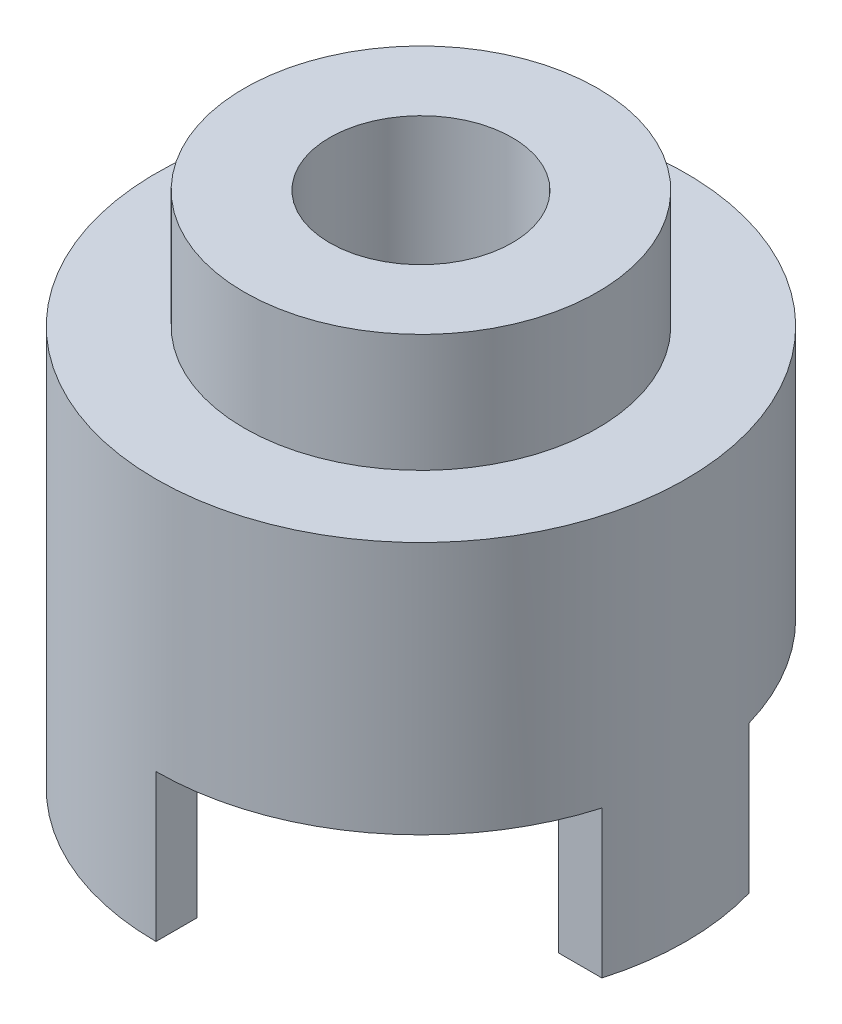
ISO-10303-21;
HEADER;
FILE_DESCRIPTION(('STEP AP214'),'2;1');
FILE_NAME('part.step','',(''),(''),'','','');
FILE_SCHEMA(('AUTOMOTIVE_DESIGN { 1 0 10303 214 1 1 1 1 }'));
ENDSEC;
DATA;
#1=APPLICATION_CONTEXT('core data for automotive mechanical design processes');
#2=APPLICATION_PROTOCOL_DEFINITION('international standard','automotive_design',2000,#1);
#3=PRODUCT_CONTEXT('',#1,'mechanical');
#4=PRODUCT('Part','Part','',(#3));
#5=PRODUCT_RELATED_PRODUCT_CATEGORY('part','',(#4));
#6=PRODUCT_DEFINITION_FORMATION('','',#4);
#7=PRODUCT_DEFINITION_CONTEXT('part definition',#1,'design');
#8=PRODUCT_DEFINITION('design','',#6,#7);
#9=PRODUCT_DEFINITION_SHAPE('','',#8);
#10=(LENGTH_UNIT() NAMED_UNIT(*) SI_UNIT(.MILLI.,.METRE.));
#11=(NAMED_UNIT(*) PLANE_ANGLE_UNIT() SI_UNIT($,.RADIAN.));
#12=(NAMED_UNIT(*) SI_UNIT($,.STERADIAN.) SOLID_ANGLE_UNIT());
#13=UNCERTAINTY_MEASURE_WITH_UNIT(LENGTH_MEASURE(1.E-05),#10,'distance_accuracy_value','');
#14=(GEOMETRIC_REPRESENTATION_CONTEXT(3) GLOBAL_UNCERTAINTY_ASSIGNED_CONTEXT((#13)) GLOBAL_UNIT_ASSIGNED_CONTEXT((#10,
#11,#12)) REPRESENTATION_CONTEXT('',''));
#15=CARTESIAN_POINT('',(0.,0.,0.));
#16=DIRECTION('',(0.,0.,1.));
#17=DIRECTION('',(1.,0.,0.));
#18=AXIS2_PLACEMENT_3D('',#15,#16,#17);
#19=CARTESIAN_POINT('',(0.,4.3,0.));
#20=DIRECTION('',(0.,-1.,0.));
#21=DIRECTION('',(0.,0.,-1.));
#22=AXIS2_PLACEMENT_3D('',#19,#20,#21);
#23=CYLINDRICAL_SURFACE('',#22,4.5);
#24=CARTESIAN_POINT('',(0.,4.3,0.));
#25=DIRECTION('',(0.,1.,0.));
#26=DIRECTION('',(0.,0.,1.));
#27=AXIS2_PLACEMENT_3D('',#24,#25,#26);
#28=CIRCLE('',#27,4.5);
#29=CARTESIAN_POINT('',(0.,4.3,4.5));
#30=VERTEX_POINT('',#29);
#31=EDGE_CURVE('E164',#30,#30,#28,.T.);
#32=ORIENTED_EDGE('',*,*,#31,.F.);
#33=EDGE_LOOP('',(#32));
#34=FACE_BOUND('',#33,.T.);
#35=DIRECTION('',(0.,-1.,0.));
#36=VECTOR('',#35,1.);
#37=CARTESIAN_POINT('',(4.32290411644764,4.3,1.25));
#38=LINE('',#37,#36);
#39=CARTESIAN_POINT('',(4.32290411644765,-2.5,1.25));
#40=VERTEX_POINT('',#39);
#41=CARTESIAN_POINT('',(4.32290411644765,0.,1.25));
#42=VERTEX_POINT('',#41);
#43=EDGE_CURVE('E130',#40,#42,#38,.F.);
#44=ORIENTED_EDGE('',*,*,#43,.F.);
#45=CARTESIAN_POINT('',(0.,-2.5,0.));
#46=DIRECTION('',(0.,-1.,0.));
#47=DIRECTION('',(0.,0.,-1.));
#48=AXIS2_PLACEMENT_3D('',#45,#46,#47);
#49=CIRCLE('',#48,4.5);
#50=CARTESIAN_POINT('',(4.32290411644765,-2.5,-1.25));
#51=VERTEX_POINT('',#50);
#52=EDGE_CURVE('E151',#51,#40,#49,.T.);
#53=ORIENTED_EDGE('',*,*,#52,.F.);
#54=DIRECTION('',(0.,-1.,0.));
#55=VECTOR('',#54,1.);
#56=CARTESIAN_POINT('',(4.32290411644764,4.3,-1.25));
#57=LINE('',#56,#55);
#58=CARTESIAN_POINT('',(4.32290411644765,0.,-1.25));
#59=VERTEX_POINT('',#58);
#60=EDGE_CURVE('E134',#59,#51,#57,.T.);
#61=ORIENTED_EDGE('',*,*,#60,.F.);
#62=CARTESIAN_POINT('',(0.,0.,0.));
#63=DIRECTION('',(0.,1.,0.));
#64=DIRECTION('',(0.,0.,1.));
#65=AXIS2_PLACEMENT_3D('',#62,#63,#64);
#66=CIRCLE('',#65,4.5);
#67=CARTESIAN_POINT('',(0.,0.,-4.5));
#68=VERTEX_POINT('',#67);
#69=EDGE_CURVE('E112',#59,#68,#66,.T.);
#70=ORIENTED_EDGE('',*,*,#69,.T.);
#71=DIRECTION('',(0.,-1.,0.));
#72=VECTOR('',#71,1.);
#73=CARTESIAN_POINT('',(0.,4.3,-4.5));
#74=LINE('',#73,#72);
#75=CARTESIAN_POINT('',(0.,-2.5,-4.5));
#76=VERTEX_POINT('',#75);
#77=EDGE_CURVE('E111',#76,#68,#74,.F.);
#78=ORIENTED_EDGE('',*,*,#77,.F.);
#79=CARTESIAN_POINT('',(0.,-2.5,4.5));
#80=VERTEX_POINT('',#79);
#81=EDGE_CURVE('E128',#80,#76,#49,.T.);
#82=ORIENTED_EDGE('',*,*,#81,.F.);
#83=DIRECTION('',(0.,-1.,0.));
#84=VECTOR('',#83,1.);
#85=CARTESIAN_POINT('',(0.,4.3,4.5));
#86=LINE('',#85,#84);
#87=CARTESIAN_POINT('',(0.,0.,4.5));
#88=VERTEX_POINT('',#87);
#89=EDGE_CURVE('E116',#88,#80,#86,.T.);
#90=ORIENTED_EDGE('',*,*,#89,.F.);
#91=EDGE_CURVE('E104',#88,#42,#66,.T.);
#92=ORIENTED_EDGE('',*,*,#91,.T.);
#93=EDGE_LOOP('',(#44,#53,#61,#70,#78,#82,#90,#92));
#94=FACE_BOUND('',#93,.T.);
#95=ADVANCED_FACE('F39',(#34,#94),#23,.T.);
#96=CARTESIAN_POINT('',(0.,-2.5,0.));
#97=DIRECTION('',(0.,-1.,0.));
#98=DIRECTION('',(0.,0.,-1.));
#99=AXIS2_PLACEMENT_3D('',#96,#97,#98);
#100=PLANE('',#99);
#101=CARTESIAN_POINT('',(0.,-2.5,0.));
#102=DIRECTION('',(0.,-1.,0.));
#103=DIRECTION('',(0.,0.,-1.));
#104=AXIS2_PLACEMENT_3D('',#101,#102,#103);
#105=CIRCLE('',#104,3.8);
#106=CARTESIAN_POINT('',(3.58852337319962,-2.5,-1.25));
#107=VERTEX_POINT('',#106);
#108=CARTESIAN_POINT('',(3.58852337319962,-2.5,1.25));
#109=VERTEX_POINT('',#108);
#110=EDGE_CURVE('E145',#107,#109,#105,.T.);
#111=ORIENTED_EDGE('',*,*,#110,.F.);
#112=DIRECTION('',(-1.,0.,0.));
#113=VECTOR('',#112,1.);
#114=CARTESIAN_POINT('',(2.95802570166385,-2.5,-1.25));
#115=LINE('',#114,#113);
#116=EDGE_CURVE('E195',#51,#107,#115,.T.);
#117=ORIENTED_EDGE('',*,*,#116,.F.);
#118=ORIENTED_EDGE('',*,*,#52,.T.);
#119=DIRECTION('',(1.,0.,0.));
#120=VECTOR('',#119,1.);
#121=CARTESIAN_POINT('',(6.55644872018276,-2.5,1.25));
#122=LINE('',#121,#120);
#123=EDGE_CURVE('E194',#109,#40,#122,.T.);
#124=ORIENTED_EDGE('',*,*,#123,.F.);
#125=EDGE_LOOP('',(#111,#117,#118,#124));
#126=FACE_BOUND('',#125,.T.);
#127=ADVANCED_FACE('F193',(#126),#100,.T.);
#128=ORIENTED_EDGE('',*,*,#81,.T.);
#129=DIRECTION('',(0.,0.,-1.));
#130=VECTOR('',#129,1.);
#131=CARTESIAN_POINT('',(0.,-2.5,-5.80931851718517));
#132=LINE('',#131,#130);
#133=CARTESIAN_POINT('',(0.,-2.5,-3.8));
#134=VERTEX_POINT('',#133);
#135=EDGE_CURVE('E122',#134,#76,#132,.T.);
#136=ORIENTED_EDGE('',*,*,#135,.F.);
#137=CARTESIAN_POINT('',(0.,-2.5,3.8));
#138=VERTEX_POINT('',#137);
#139=EDGE_CURVE('E141',#138,#134,#105,.T.);
#140=ORIENTED_EDGE('',*,*,#139,.F.);
#141=EDGE_CURVE('E203',#80,#138,#132,.T.);
#142=ORIENTED_EDGE('',*,*,#141,.F.);
#143=EDGE_LOOP('',(#128,#136,#140,#142));
#144=FACE_BOUND('',#143,.T.);
#145=ADVANCED_FACE('F215',(#144),#100,.T.);
#146=CARTESIAN_POINT('',(0.,-2.5,0.));
#147=DIRECTION('',(0.,1.,0.));
#148=DIRECTION('',(0.,0.,1.));
#149=AXIS2_PLACEMENT_3D('',#146,#147,#148);
#150=CYLINDRICAL_SURFACE('',#149,3.8);
#151=CARTESIAN_POINT('',(0.,0.,0.));
#152=DIRECTION('',(0.,-1.,0.));
#153=DIRECTION('',(0.,0.,-1.));
#154=AXIS2_PLACEMENT_3D('',#151,#152,#153);
#155=CIRCLE('',#154,3.8);
#156=CARTESIAN_POINT('',(3.58852337319962,0.,-1.25));
#157=VERTEX_POINT('',#156);
#158=CARTESIAN_POINT('',(3.58852337319962,0.,1.25));
#159=VERTEX_POINT('',#158);
#160=EDGE_CURVE('E146',#157,#159,#155,.T.);
#161=ORIENTED_EDGE('',*,*,#160,.F.);
#162=DIRECTION('',(0.,1.,0.));
#163=VECTOR('',#162,1.);
#164=CARTESIAN_POINT('',(3.58852337319962,-2.5,-1.25));
#165=LINE('',#164,#163);
#166=EDGE_CURVE('E11',#157,#107,#165,.F.);
#167=ORIENTED_EDGE('',*,*,#166,.T.);
#168=ORIENTED_EDGE('',*,*,#110,.T.);
#169=DIRECTION('',(0.,1.,0.));
#170=VECTOR('',#169,1.);
#171=CARTESIAN_POINT('',(3.58852337319962,-2.5,1.25));
#172=LINE('',#171,#170);
#173=EDGE_CURVE('E47',#109,#159,#172,.T.);
#174=ORIENTED_EDGE('',*,*,#173,.T.);
#175=EDGE_LOOP('',(#161,#167,#168,#174));
#176=FACE_BOUND('',#175,.T.);
#177=ADVANCED_FACE('F182',(#176),#150,.F.);
#178=ORIENTED_EDGE('',*,*,#139,.T.);
#179=DIRECTION('',(0.,1.,0.));
#180=VECTOR('',#179,1.);
#181=CARTESIAN_POINT('',(0.,-2.5,-3.8));
#182=LINE('',#181,#180);
#183=CARTESIAN_POINT('',(0.,0.,-3.8));
#184=VERTEX_POINT('',#183);
#185=EDGE_CURVE('E174',#134,#184,#182,.T.);
#186=ORIENTED_EDGE('',*,*,#185,.T.);
#187=CARTESIAN_POINT('',(0.,0.,3.8));
#188=VERTEX_POINT('',#187);
#189=EDGE_CURVE('E140',#188,#184,#155,.T.);
#190=ORIENTED_EDGE('',*,*,#189,.F.);
#191=DIRECTION('',(0.,1.,0.));
#192=VECTOR('',#191,1.);
#193=CARTESIAN_POINT('',(0.,-2.5,3.8));
#194=LINE('',#193,#192);
#195=EDGE_CURVE('E119',#188,#138,#194,.F.);
#196=ORIENTED_EDGE('',*,*,#195,.T.);
#197=EDGE_LOOP('',(#178,#186,#190,#196));
#198=FACE_BOUND('',#197,.T.);
#199=ADVANCED_FACE('F221',(#198),#150,.F.);
#200=CARTESIAN_POINT('',(0.,0.,0.));
#201=DIRECTION('',(0.,1.,0.));
#202=DIRECTION('',(0.,0.,1.));
#203=AXIS2_PLACEMENT_3D('',#200,#201,#202);
#204=PLANE('',#203);
#205=CARTESIAN_POINT('',(0.,0.,0.));
#206=DIRECTION('',(0.,1.,0.));
#207=DIRECTION('',(0.,0.,1.));
#208=AXIS2_PLACEMENT_3D('',#205,#206,#207);
#209=CIRCLE('',#208,1.55);
#210=CARTESIAN_POINT('',(0.,0.,1.55));
#211=VERTEX_POINT('',#210);
#212=EDGE_CURVE('E152',#211,#211,#209,.T.);
#213=ORIENTED_EDGE('',*,*,#212,.T.);
#214=EDGE_LOOP('',(#213));
#215=FACE_BOUND('',#214,.T.);
#216=DIRECTION('',(0.,0.,-1.));
#217=VECTOR('',#216,1.);
#218=CARTESIAN_POINT('',(0.,0.,0.));
#219=LINE('',#218,#217);
#220=EDGE_CURVE('E54',#88,#188,#219,.T.);
#221=ORIENTED_EDGE('',*,*,#220,.T.);
#222=ORIENTED_EDGE('',*,*,#189,.T.);
#223=EDGE_CURVE('E123',#184,#68,#219,.T.);
#224=ORIENTED_EDGE('',*,*,#223,.T.);
#225=ORIENTED_EDGE('',*,*,#69,.F.);
#226=DIRECTION('',(-1.,0.,0.));
#227=VECTOR('',#226,1.);
#228=CARTESIAN_POINT('',(2.95802570166385,0.,-1.25));
#229=LINE('',#228,#227);
#230=EDGE_CURVE('E61',#59,#157,#229,.T.);
#231=ORIENTED_EDGE('',*,*,#230,.T.);
#232=ORIENTED_EDGE('',*,*,#160,.T.);
#233=DIRECTION('',(1.,0.,0.));
#234=VECTOR('',#233,1.);
#235=CARTESIAN_POINT('',(6.55644872018276,0.,1.25));
#236=LINE('',#235,#234);
#237=EDGE_CURVE('E106',#159,#42,#236,.T.);
#238=ORIENTED_EDGE('',*,*,#237,.T.);
#239=ORIENTED_EDGE('',*,*,#91,.F.);
#240=EDGE_LOOP('',(#221,#222,#224,#225,#231,#232,#238,#239));
#241=FACE_BOUND('',#240,.T.);
#242=ADVANCED_FACE('F105',(#215,#241),#204,.F.);
#243=CARTESIAN_POINT('',(0.,4.3,0.));
#244=DIRECTION('',(0.,1.,0.));
#245=DIRECTION('',(0.,0.,1.));
#246=AXIS2_PLACEMENT_3D('',#243,#244,#245);
#247=PLANE('',#246);
#248=CARTESIAN_POINT('',(0.,4.3,0.));
#249=DIRECTION('',(0.,1.,0.));
#250=DIRECTION('',(0.,0.,1.));
#251=AXIS2_PLACEMENT_3D('',#248,#249,#250);
#252=CIRCLE('',#251,3.);
#253=CARTESIAN_POINT('',(0.,4.3,3.));
#254=VERTEX_POINT('',#253);
#255=EDGE_CURVE('E165',#254,#254,#252,.T.);
#256=ORIENTED_EDGE('',*,*,#255,.F.);
#257=EDGE_LOOP('',(#256));
#258=FACE_BOUND('',#257,.T.);
#259=ORIENTED_EDGE('',*,*,#31,.T.);
#260=EDGE_LOOP('',(#259));
#261=FACE_BOUND('',#260,.T.);
#262=ADVANCED_FACE('F228',(#258,#261),#247,.T.);
#263=CARTESIAN_POINT('',(0.,6.3,0.));
#264=DIRECTION('',(0.,-1.,0.));
#265=DIRECTION('',(0.,0.,-1.));
#266=AXIS2_PLACEMENT_3D('',#263,#264,#265);
#267=CYLINDRICAL_SURFACE('',#266,3.);
#268=CARTESIAN_POINT('',(0.,6.3,0.));
#269=DIRECTION('',(0.,1.,0.));
#270=DIRECTION('',(0.,0.,1.));
#271=AXIS2_PLACEMENT_3D('',#268,#269,#270);
#272=CIRCLE('',#271,3.);
#273=CARTESIAN_POINT('',(0.,6.3,3.));
#274=VERTEX_POINT('',#273);
#275=EDGE_CURVE('E156',#274,#274,#272,.T.);
#276=ORIENTED_EDGE('',*,*,#275,.F.);
#277=EDGE_LOOP('',(#276));
#278=FACE_BOUND('',#277,.T.);
#279=ORIENTED_EDGE('',*,*,#255,.T.);
#280=EDGE_LOOP('',(#279));
#281=FACE_BOUND('',#280,.T.);
#282=ADVANCED_FACE('F240',(#278,#281),#267,.T.);
#283=CARTESIAN_POINT('',(0.,6.3,0.));
#284=DIRECTION('',(0.,1.,0.));
#285=DIRECTION('',(0.,0.,1.));
#286=AXIS2_PLACEMENT_3D('',#283,#284,#285);
#287=PLANE('',#286);
#288=CARTESIAN_POINT('',(0.,6.3,0.));
#289=DIRECTION('',(0.,1.,0.));
#290=DIRECTION('',(0.,0.,1.));
#291=AXIS2_PLACEMENT_3D('',#288,#289,#290);
#292=CIRCLE('',#291,1.55);
#293=CARTESIAN_POINT('',(0.,6.3,1.55));
#294=VERTEX_POINT('',#293);
#295=EDGE_CURVE('E157',#294,#294,#292,.T.);
#296=ORIENTED_EDGE('',*,*,#295,.F.);
#297=EDGE_LOOP('',(#296));
#298=FACE_BOUND('',#297,.T.);
#299=ORIENTED_EDGE('',*,*,#275,.T.);
#300=EDGE_LOOP('',(#299));
#301=FACE_BOUND('',#300,.T.);
#302=ADVANCED_FACE('F246',(#298,#301),#287,.T.);
#303=CARTESIAN_POINT('',(0.,0.,0.));
#304=DIRECTION('',(0.,1.,0.));
#305=DIRECTION('',(0.,0.,1.));
#306=AXIS2_PLACEMENT_3D('',#303,#304,#305);
#307=CYLINDRICAL_SURFACE('',#306,1.55);
#308=ORIENTED_EDGE('',*,*,#212,.F.);
#309=EDGE_LOOP('',(#308));
#310=FACE_BOUND('',#309,.T.);
#311=ORIENTED_EDGE('',*,*,#295,.T.);
#312=EDGE_LOOP('',(#311));
#313=FACE_BOUND('',#312,.T.);
#314=ADVANCED_FACE('F253',(#310,#313),#307,.F.);
#315=CARTESIAN_POINT('',(0.,-2.5,0.));
#316=DIRECTION('',(1.,0.,0.));
#317=DIRECTION('',(0.,0.,-1.));
#318=AXIS2_PLACEMENT_3D('',#315,#316,#317);
#319=PLANE('',#318);
#320=ORIENTED_EDGE('',*,*,#77,.T.);
#321=ORIENTED_EDGE('',*,*,#223,.F.);
#322=ORIENTED_EDGE('',*,*,#185,.F.);
#323=ORIENTED_EDGE('',*,*,#135,.T.);
#324=EDGE_LOOP('',(#320,#321,#322,#323));
#325=FACE_BOUND('',#324,.T.);
#326=ADVANCED_FACE('F219',(#325),#319,.T.);
#327=CARTESIAN_POINT('',(2.95802570166385,-2.5,-1.25));
#328=DIRECTION('',(0.,0.,-1.));
#329=DIRECTION('',(-1.,0.,0.));
#330=AXIS2_PLACEMENT_3D('',#327,#328,#329);
#331=PLANE('',#330);
#332=ORIENTED_EDGE('',*,*,#60,.T.);
#333=ORIENTED_EDGE('',*,*,#116,.T.);
#334=ORIENTED_EDGE('',*,*,#166,.F.);
#335=ORIENTED_EDGE('',*,*,#230,.F.);
#336=EDGE_LOOP('',(#332,#333,#334,#335));
#337=FACE_BOUND('',#336,.T.);
#338=ADVANCED_FACE('F260',(#337),#331,.T.);
#339=CARTESIAN_POINT('',(6.55644872018276,-2.5,1.25));
#340=DIRECTION('',(0.,0.,1.));
#341=DIRECTION('',(1.,0.,0.));
#342=AXIS2_PLACEMENT_3D('',#339,#340,#341);
#343=PLANE('',#342);
#344=ORIENTED_EDGE('',*,*,#43,.T.);
#345=ORIENTED_EDGE('',*,*,#237,.F.);
#346=ORIENTED_EDGE('',*,*,#173,.F.);
#347=ORIENTED_EDGE('',*,*,#123,.T.);
#348=EDGE_LOOP('',(#344,#345,#346,#347));
#349=FACE_BOUND('',#348,.T.);
#350=ADVANCED_FACE('F198',(#349),#343,.T.);
#351=ORIENTED_EDGE('',*,*,#89,.T.);
#352=ORIENTED_EDGE('',*,*,#141,.T.);
#353=ORIENTED_EDGE('',*,*,#195,.F.);
#354=ORIENTED_EDGE('',*,*,#220,.F.);
#355=EDGE_LOOP('',(#351,#352,#353,#354));
#356=FACE_BOUND('',#355,.T.);
#357=ADVANCED_FACE('F115',(#356),#319,.T.);
#358=CLOSED_SHELL('',(#95,#127,#145,#177,#199,#242,#262,#282,#302,#314,#326,#338,#350,#357));
#359=MANIFOLD_SOLID_BREP('B2',#358);
#360=ADVANCED_BREP_SHAPE_REPRESENTATION('',(#18,#359),#14);
#361=SHAPE_DEFINITION_REPRESENTATION(#9,#360);
ENDSEC;
END-ISO-10303-21;
